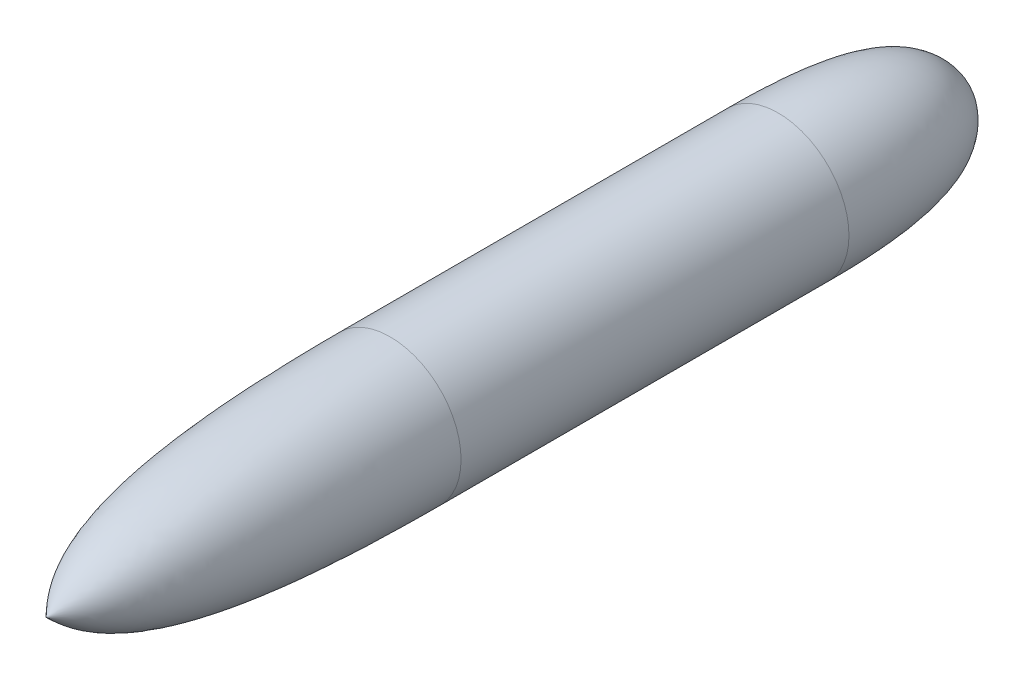
ISO-10303-21;
HEADER;
FILE_DESCRIPTION(('STEP AP214'),'2;1');
FILE_NAME('part.step','',(''),(''),'','','');
FILE_SCHEMA(('AUTOMOTIVE_DESIGN { 1 0 10303 214 1 1 1 1 }'));
ENDSEC;
DATA;
#1=APPLICATION_CONTEXT('core data for automotive mechanical design processes');
#2=APPLICATION_PROTOCOL_DEFINITION('international standard','automotive_design',2000,#1);
#3=PRODUCT_CONTEXT('',#1,'mechanical');
#4=PRODUCT('Part','Part','',(#3));
#5=PRODUCT_RELATED_PRODUCT_CATEGORY('part','',(#4));
#6=PRODUCT_DEFINITION_FORMATION('','',#4);
#7=PRODUCT_DEFINITION_CONTEXT('part definition',#1,'design');
#8=PRODUCT_DEFINITION('design','',#6,#7);
#9=PRODUCT_DEFINITION_SHAPE('','',#8);
#10=(LENGTH_UNIT() NAMED_UNIT(*) SI_UNIT(.MILLI.,.METRE.));
#11=(NAMED_UNIT(*) PLANE_ANGLE_UNIT() SI_UNIT($,.RADIAN.));
#12=(NAMED_UNIT(*) SI_UNIT($,.STERADIAN.) SOLID_ANGLE_UNIT());
#13=UNCERTAINTY_MEASURE_WITH_UNIT(LENGTH_MEASURE(1.E-05),#10,'distance_accuracy_value','');
#14=(GEOMETRIC_REPRESENTATION_CONTEXT(3) GLOBAL_UNCERTAINTY_ASSIGNED_CONTEXT((#13)) GLOBAL_UNIT_ASSIGNED_CONTEXT((#10,
#11,#12)) REPRESENTATION_CONTEXT('',''));
#15=CARTESIAN_POINT('',(0.,0.,0.));
#16=DIRECTION('',(0.,0.,1.));
#17=DIRECTION('',(1.,0.,0.));
#18=AXIS2_PLACEMENT_3D('',#15,#16,#17);
#19=CARTESIAN_POINT('',(0.,0.,0.));
#20=CARTESIAN_POINT('',(189.032932604903,0.,-198.051674110481));
#21=CARTESIAN_POINT('',(431.8,0.,-469.236499398195));
#22=CARTESIAN_POINT('',(431.8,0.,-2098.45014643614));
#23=B_SPLINE_CURVE_WITH_KNOTS('',3,(#19,#20,#21,#22),.UNSPECIFIED.,.F.,.F.,(4,4),(0.,1.),.UNSPECIFIED.);
#24=CARTESIAN_POINT('',(0.,0.,0.));
#25=DIRECTION('',(0.,0.,1.));
#26=AXIS1_PLACEMENT('',#24,#25);
#27=SURFACE_OF_REVOLUTION('',#23,#26);
#28=CARTESIAN_POINT('',(0.,0.,-2098.45014643614));
#29=DIRECTION('',(0.,0.,1.));
#30=DIRECTION('',(1.,0.,0.));
#31=AXIS2_PLACEMENT_3D('',#28,#29,#30);
#32=CIRCLE('',#31,431.8);
#33=CARTESIAN_POINT('',(431.8,0.,-2098.45014643614));
#34=VERTEX_POINT('',#33);
#35=EDGE_CURVE('E54',#34,#34,#32,.T.);
#36=ORIENTED_EDGE('',*,*,#35,.T.);
#37=EDGE_LOOP('',(#36));
#38=FACE_BOUND('',#37,.T.);
#39=CARTESIAN_POINT('',(0.,0.,0.));
#40=VERTEX_POINT('',#39);
#41=VERTEX_LOOP('',#40);
#42=FACE_BOUND('',#41,.T.);
#43=ADVANCED_FACE('F45',(#38,#42),#27,.F.);
#44=CARTESIAN_POINT('',(431.8,0.,-4463.21170055634));
#45=CARTESIAN_POINT('',(431.8,0.,-5266.69471064858));
#46=CARTESIAN_POINT('',(300.788242874944,0.,-5495.83791449046));
#47=CARTESIAN_POINT('',(0.,0.,-5588.));
#48=B_SPLINE_CURVE_WITH_KNOTS('',3,(#44,#45,#46,#47),.UNSPECIFIED.,.F.,.F.,(4,4),(0.,1.),.UNSPECIFIED.);
#49=CARTESIAN_POINT('',(0.,0.,0.));
#50=DIRECTION('',(0.,0.,1.));
#51=AXIS1_PLACEMENT('',#49,#50);
#52=SURFACE_OF_REVOLUTION('',#48,#51);
#53=CARTESIAN_POINT('',(0.,0.,-5588.));
#54=VERTEX_POINT('',#53);
#55=VERTEX_LOOP('',#54);
#56=FACE_BOUND('',#55,.T.);
#57=CARTESIAN_POINT('',(0.,0.,-4463.21170055634));
#58=DIRECTION('',(0.,0.,1.));
#59=DIRECTION('',(1.,0.,0.));
#60=AXIS2_PLACEMENT_3D('',#57,#58,#59);
#61=CIRCLE('',#60,431.8);
#62=CARTESIAN_POINT('',(431.8,0.,-4463.21170055634));
#63=VERTEX_POINT('',#62);
#64=EDGE_CURVE('E11',#63,#63,#61,.T.);
#65=ORIENTED_EDGE('',*,*,#64,.F.);
#66=EDGE_LOOP('',(#65));
#67=FACE_BOUND('',#66,.T.);
#68=ADVANCED_FACE('F60',(#56,#67),#52,.F.);
#69=CARTESIAN_POINT('',(0.,0.,0.));
#70=DIRECTION('',(0.,0.,1.));
#71=DIRECTION('',(1.,0.,0.));
#72=AXIS2_PLACEMENT_3D('',#69,#70,#71);
#73=CYLINDRICAL_SURFACE('',#72,431.8);
#74=ORIENTED_EDGE('',*,*,#64,.T.);
#75=EDGE_LOOP('',(#74));
#76=FACE_BOUND('',#75,.T.);
#77=ORIENTED_EDGE('',*,*,#35,.F.);
#78=EDGE_LOOP('',(#77));
#79=FACE_BOUND('',#78,.T.);
#80=ADVANCED_FACE('F63',(#76,#79),#73,.T.);
#81=CLOSED_SHELL('',(#43,#68,#80));
#82=MANIFOLD_SOLID_BREP('B2',#81);
#83=ADVANCED_BREP_SHAPE_REPRESENTATION('',(#18,#82),#14);
#84=SHAPE_DEFINITION_REPRESENTATION(#9,#83);
ENDSEC;
END-ISO-10303-21;
